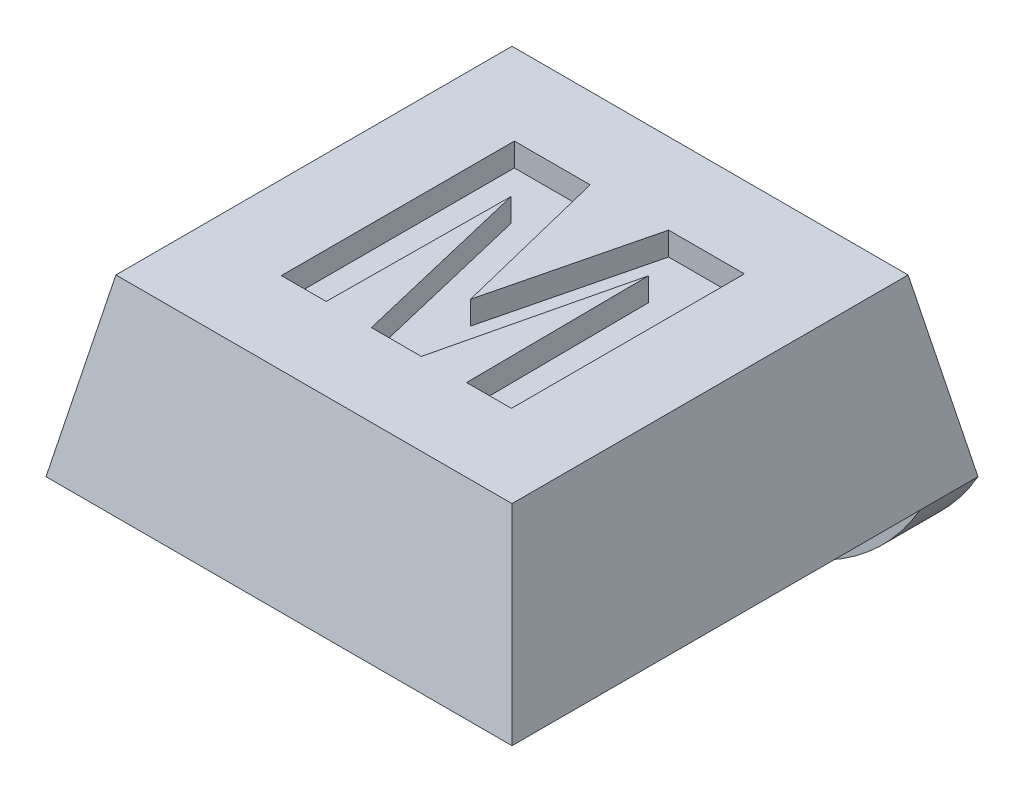
ISO-10303-21;
HEADER;
FILE_DESCRIPTION(('STEP AP214'),'2;1');
FILE_NAME('part.step','',(''),(''),'','','');
FILE_SCHEMA(('AUTOMOTIVE_DESIGN { 1 0 10303 214 1 1 1 1 }'));
ENDSEC;
DATA;
#1=APPLICATION_CONTEXT('core data for automotive mechanical design processes');
#2=APPLICATION_PROTOCOL_DEFINITION('international standard','automotive_design',2000,#1);
#3=PRODUCT_CONTEXT('',#1,'mechanical');
#4=PRODUCT('Part','Part','',(#3));
#5=PRODUCT_RELATED_PRODUCT_CATEGORY('part','',(#4));
#6=PRODUCT_DEFINITION_FORMATION('','',#4);
#7=PRODUCT_DEFINITION_CONTEXT('part definition',#1,'design');
#8=PRODUCT_DEFINITION('design','',#6,#7);
#9=PRODUCT_DEFINITION_SHAPE('','',#8);
#10=(LENGTH_UNIT() NAMED_UNIT(*) SI_UNIT(.MILLI.,.METRE.));
#11=(NAMED_UNIT(*) PLANE_ANGLE_UNIT() SI_UNIT($,.RADIAN.));
#12=(NAMED_UNIT(*) SI_UNIT($,.STERADIAN.) SOLID_ANGLE_UNIT());
#13=UNCERTAINTY_MEASURE_WITH_UNIT(LENGTH_MEASURE(1.E-05),#10,'distance_accuracy_value','');
#14=(GEOMETRIC_REPRESENTATION_CONTEXT(3) GLOBAL_UNCERTAINTY_ASSIGNED_CONTEXT((#13)) GLOBAL_UNIT_ASSIGNED_CONTEXT((#10,
#11,#12)) REPRESENTATION_CONTEXT('',''));
#15=CARTESIAN_POINT('',(0.,0.,0.));
#16=DIRECTION('',(0.,0.,1.));
#17=DIRECTION('',(1.,0.,0.));
#18=AXIS2_PLACEMENT_3D('',#15,#16,#17);
#19=CARTESIAN_POINT('',(0.,3.,0.));
#20=DIRECTION('',(0.,-1.,0.));
#21=DIRECTION('',(0.,0.,-1.));
#22=AXIS2_PLACEMENT_3D('',#19,#20,#21);
#23=PLANE('',#22);
#24=DIRECTION('',(-1.,0.,0.));
#25=VECTOR('',#24,1.);
#26=CARTESIAN_POINT('',(11.,3.,-0.6));
#27=LINE('',#26,#25);
#28=CARTESIAN_POINT('',(7.4,3.,-0.6));
#29=VERTEX_POINT('',#28);
#30=CARTESIAN_POINT('',(0.6,3.,-0.6));
#31=VERTEX_POINT('',#30);
#32=EDGE_CURVE('E236',#29,#31,#27,.T.);
#33=ORIENTED_EDGE('',*,*,#32,.F.);
#34=DIRECTION('',(0.,0.,1.));
#35=VECTOR('',#34,1.);
#36=CARTESIAN_POINT('',(7.4,3.,-8.));
#37=LINE('',#36,#35);
#38=CARTESIAN_POINT('',(7.4,3.,-7.4));
#39=VERTEX_POINT('',#38);
#40=EDGE_CURVE('E249',#39,#29,#37,.T.);
#41=ORIENTED_EDGE('',*,*,#40,.F.);
#42=DIRECTION('',(-1.,0.,0.));
#43=VECTOR('',#42,1.);
#44=CARTESIAN_POINT('',(11.,3.,-7.4));
#45=LINE('',#44,#43);
#46=CARTESIAN_POINT('',(0.599999999999999,3.,-7.4));
#47=VERTEX_POINT('',#46);
#48=EDGE_CURVE('E232',#39,#47,#45,.T.);
#49=ORIENTED_EDGE('',*,*,#48,.T.);
#50=DIRECTION('',(0.,0.,1.));
#51=VECTOR('',#50,1.);
#52=CARTESIAN_POINT('',(0.6,3.,-8.));
#53=LINE('',#52,#51);
#54=EDGE_CURVE('E252',#47,#31,#53,.T.);
#55=ORIENTED_EDGE('',*,*,#54,.T.);
#56=EDGE_LOOP('',(#33,#41,#49,#55));
#57=FACE_BOUND('',#56,.T.);
#58=DIRECTION('',(-1.,0.,0.));
#59=VECTOR('',#58,1.);
#60=CARTESIAN_POINT('',(2.79952143387891,3.,-2.0105672247147));
#61=LINE('',#60,#59);
#62=CARTESIAN_POINT('',(2.79952143387891,3.,-2.0105672247147));
#63=VERTEX_POINT('',#62);
#64=CARTESIAN_POINT('',(2.03029066464814,3.,-2.0105672247147));
#65=VERTEX_POINT('',#64);
#66=EDGE_CURVE('E59',#63,#65,#61,.T.);
#67=ORIENTED_EDGE('',*,*,#66,.T.);
#68=DIRECTION('',(0.,0.,-1.));
#69=VECTOR('',#68,1.);
#70=CARTESIAN_POINT('',(2.03029066464814,3.,-2.0105672247147));
#71=LINE('',#70,#69);
#72=CARTESIAN_POINT('',(2.03029066464814,3.,-6.0105672247147));
#73=VERTEX_POINT('',#72);
#74=EDGE_CURVE('E204',#65,#73,#71,.T.);
#75=ORIENTED_EDGE('',*,*,#74,.T.);
#76=DIRECTION('',(1.,0.,0.));
#77=VECTOR('',#76,1.);
#78=CARTESIAN_POINT('',(2.03029066464814,3.,-6.0105672247147));
#79=LINE('',#78,#77);
#80=CARTESIAN_POINT('',(3.33157271593019,3.,-6.0105672247147));
#81=VERTEX_POINT('',#80);
#82=EDGE_CURVE('E688',#73,#81,#79,.T.);
#83=ORIENTED_EDGE('',*,*,#82,.T.);
#84=DIRECTION('',(0.239515349551575,0.,0.970892577646563));
#85=VECTOR('',#84,1.);
#86=CARTESIAN_POINT('',(3.33157271593019,3.,-6.0105672247147));
#87=LINE('',#86,#85);
#88=CARTESIAN_POINT('',(4.00464963900711,3.,-3.28220184009932));
#89=VERTEX_POINT('',#88);
#90=EDGE_CURVE('E690',#81,#89,#87,.T.);
#91=ORIENTED_EDGE('',*,*,#90,.T.);
#92=DIRECTION('',(0.239515349551575,0.,-0.970892577646563));
#93=VECTOR('',#92,1.);
#94=CARTESIAN_POINT('',(4.00464963900711,3.,-3.28220184009932));
#95=LINE('',#94,#93);
#96=CARTESIAN_POINT('',(4.67772656208403,3.,-6.0105672247147));
#97=VERTEX_POINT('',#96);
#98=EDGE_CURVE('E695',#89,#97,#95,.T.);
#99=ORIENTED_EDGE('',*,*,#98,.T.);
#100=DIRECTION('',(1.,0.,0.));
#101=VECTOR('',#100,1.);
#102=CARTESIAN_POINT('',(4.67772656208403,3.,-6.0105672247147));
#103=LINE('',#102,#101);
#104=CARTESIAN_POINT('',(5.97900861336609,3.,-6.0105672247147));
#105=VERTEX_POINT('',#104);
#106=EDGE_CURVE('E705',#97,#105,#103,.T.);
#107=ORIENTED_EDGE('',*,*,#106,.T.);
#108=DIRECTION('',(0.,0.,1.));
#109=VECTOR('',#108,1.);
#110=CARTESIAN_POINT('',(5.97900861336609,3.,-6.0105672247147));
#111=LINE('',#110,#109);
#112=CARTESIAN_POINT('',(5.97900861336609,3.,-2.0105672247147));
#113=VERTEX_POINT('',#112);
#114=EDGE_CURVE('E709',#105,#113,#111,.T.);
#115=ORIENTED_EDGE('',*,*,#114,.T.);
#116=DIRECTION('',(-1.,0.,0.));
#117=VECTOR('',#116,1.);
#118=CARTESIAN_POINT('',(5.97900861336609,3.,-2.0105672247147));
#119=LINE('',#118,#117);
#120=CARTESIAN_POINT('',(5.20977784413532,3.,-2.0105672247147));
#121=VERTEX_POINT('',#120);
#122=EDGE_CURVE('E713',#113,#121,#119,.T.);
#123=ORIENTED_EDGE('',*,*,#122,.T.);
#124=DIRECTION('',(-0.00814222372760895,0.,-0.999966851546975));
#125=VECTOR('',#124,1.);
#126=CARTESIAN_POINT('',(5.20977784413532,3.,-2.0105672247147));
#127=LINE('',#126,#125);
#128=CARTESIAN_POINT('',(5.18413681849429,3.,-5.15960568625316));
#129=VERTEX_POINT('',#128);
#130=EDGE_CURVE('E717',#121,#129,#127,.T.);
#131=ORIENTED_EDGE('',*,*,#130,.T.);
#132=DIRECTION('',(-0.231921677320602,0.,0.972734463041584));
#133=VECTOR('',#132,1.);
#134=CARTESIAN_POINT('',(5.18413681849429,3.,-5.15960568625316));
#135=LINE('',#134,#133);
#136=CARTESIAN_POINT('',(4.43333553644301,3.,-2.0105672247147));
#137=VERTEX_POINT('',#136);
#138=EDGE_CURVE('E651',#129,#137,#135,.T.);
#139=ORIENTED_EDGE('',*,*,#138,.T.);
#140=DIRECTION('',(-1.,0.,0.));
#141=VECTOR('',#140,1.);
#142=CARTESIAN_POINT('',(4.43333553644301,3.,-2.0105672247147));
#143=LINE('',#142,#141);
#144=CARTESIAN_POINT('',(3.57596374157121,3.,-2.0105672247147));
#145=VERTEX_POINT('',#144);
#146=EDGE_CURVE('E646',#137,#145,#143,.T.);
#147=ORIENTED_EDGE('',*,*,#146,.T.);
#148=DIRECTION('',(-0.231921677320602,0.,-0.972734463041584));
#149=VECTOR('',#148,1.);
#150=CARTESIAN_POINT('',(3.57596374157121,3.,-2.0105672247147));
#151=LINE('',#150,#149);
#152=CARTESIAN_POINT('',(2.82516245951993,3.,-5.15960568625316));
#153=VERTEX_POINT('',#152);
#154=EDGE_CURVE('E640',#145,#153,#151,.T.);
#155=ORIENTED_EDGE('',*,*,#154,.T.);
#156=DIRECTION('',(-0.00814222372760895,0.,0.999966851546975));
#157=VECTOR('',#156,1.);
#158=CARTESIAN_POINT('',(2.82516245951993,3.,-5.15960568625316));
#159=LINE('',#158,#157);
#160=EDGE_CURVE('E200',#153,#63,#159,.T.);
#161=ORIENTED_EDGE('',*,*,#160,.T.);
#162=EDGE_LOOP('',(#67,#75,#83,#91,#99,#107,#115,#123,#131,#139,#147,#155,#161));
#163=FACE_BOUND('',#162,.T.);
#164=ADVANCED_FACE('F43',(#57,#163),#23,.F.);
#165=CARTESIAN_POINT('',(8.,0.,-8.));
#166=DIRECTION('',(-0.98058067569092,-0.196116135138184,0.));
#167=DIRECTION('',(0.196116135138184,-0.98058067569092,0.));
#168=AXIS2_PLACEMENT_3D('',#165,#166,#167);
#169=PLANE('',#168);
#170=DIRECTION('',(-0.192450089729875,0.962250448649376,-0.192450089729875));
#171=VECTOR('',#170,1.);
#172=CARTESIAN_POINT('',(7.7037037037037,1.48148148148148,-0.296296296296296));
#173=LINE('',#172,#171);
#174=CARTESIAN_POINT('',(8.,0.,0.));
#175=VERTEX_POINT('',#174);
#176=EDGE_CURVE('E246',#175,#29,#173,.T.);
#177=ORIENTED_EDGE('',*,*,#176,.F.);
#178=DIRECTION('',(0.,0.,-1.));
#179=VECTOR('',#178,1.);
#180=CARTESIAN_POINT('',(8.,0.,0.));
#181=LINE('',#180,#179);
#182=CARTESIAN_POINT('',(8.,0.,-7.));
#183=VERTEX_POINT('',#182);
#184=EDGE_CURVE('E265',#175,#183,#181,.T.);
#185=ORIENTED_EDGE('',*,*,#184,.T.);
#186=DIRECTION('',(0.,0.,1.));
#187=VECTOR('',#186,1.);
#188=CARTESIAN_POINT('',(8.,0.,-8.));
#189=LINE('',#188,#187);
#190=CARTESIAN_POINT('',(8.,0.,-8.));
#191=VERTEX_POINT('',#190);
#192=EDGE_CURVE('E206',#191,#183,#189,.T.);
#193=ORIENTED_EDGE('',*,*,#192,.F.);
#194=DIRECTION('',(0.192450089729875,-0.962250448649376,-0.192450089729875));
#195=VECTOR('',#194,1.);
#196=CARTESIAN_POINT('',(8.,0.,-8.));
#197=LINE('',#196,#195);
#198=EDGE_CURVE('E239',#39,#191,#197,.T.);
#199=ORIENTED_EDGE('',*,*,#198,.F.);
#200=ORIENTED_EDGE('',*,*,#40,.T.);
#201=EDGE_LOOP('',(#177,#185,#193,#199,#200));
#202=FACE_BOUND('',#201,.T.);
#203=ADVANCED_FACE('F333',(#202),#169,.F.);
#204=CARTESIAN_POINT('',(0.,0.,-8.));
#205=DIRECTION('',(0.98058067569092,-0.196116135138184,0.));
#206=DIRECTION('',(0.196116135138184,0.98058067569092,0.));
#207=AXIS2_PLACEMENT_3D('',#204,#205,#206);
#208=PLANE('',#207);
#209=DIRECTION('',(-0.192450089729875,-0.962250448649376,0.192450089729875));
#210=VECTOR('',#209,1.);
#211=CARTESIAN_POINT('',(0.296296296296296,1.48148148148148,-0.296296296296296));
#212=LINE('',#211,#210);
#213=CARTESIAN_POINT('',(0.,0.,0.));
#214=VERTEX_POINT('',#213);
#215=EDGE_CURVE('E293',#31,#214,#212,.T.);
#216=ORIENTED_EDGE('',*,*,#215,.F.);
#217=ORIENTED_EDGE('',*,*,#54,.F.);
#218=DIRECTION('',(0.192450089729875,0.962250448649376,0.192450089729875));
#219=VECTOR('',#218,1.);
#220=CARTESIAN_POINT('',(0.,0.,-8.));
#221=LINE('',#220,#219);
#222=CARTESIAN_POINT('',(0.,0.,-8.));
#223=VERTEX_POINT('',#222);
#224=EDGE_CURVE('E264',#223,#47,#221,.T.);
#225=ORIENTED_EDGE('',*,*,#224,.F.);
#226=DIRECTION('',(0.,0.,1.));
#227=VECTOR('',#226,1.);
#228=CARTESIAN_POINT('',(0.,0.,0.));
#229=LINE('',#228,#227);
#230=CARTESIAN_POINT('',(0.,0.,-7.));
#231=VERTEX_POINT('',#230);
#232=EDGE_CURVE('E269',#223,#231,#229,.T.);
#233=ORIENTED_EDGE('',*,*,#232,.T.);
#234=EDGE_CURVE('E256',#231,#214,#229,.T.);
#235=ORIENTED_EDGE('',*,*,#234,.T.);
#236=EDGE_LOOP('',(#216,#217,#225,#233,#235));
#237=FACE_BOUND('',#236,.T.);
#238=ADVANCED_FACE('F317',(#237),#208,.F.);
#239=CARTESIAN_POINT('',(0.,0.,0.));
#240=DIRECTION('',(0.,-1.,0.));
#241=DIRECTION('',(0.,0.,-1.));
#242=AXIS2_PLACEMENT_3D('',#239,#240,#241);
#243=PLANE('',#242);
#244=DIRECTION('',(-1.,0.,0.));
#245=VECTOR('',#244,1.);
#246=CARTESIAN_POINT('',(0.,0.,-7.));
#247=LINE('',#246,#245);
#248=EDGE_CURVE('E212',#183,#231,#247,.T.);
#249=ORIENTED_EDGE('',*,*,#248,.F.);
#250=ORIENTED_EDGE('',*,*,#184,.F.);
#251=DIRECTION('',(1.,0.,0.));
#252=VECTOR('',#251,1.);
#253=CARTESIAN_POINT('',(0.,0.,0.));
#254=LINE('',#253,#252);
#255=EDGE_CURVE('E266',#214,#175,#254,.T.);
#256=ORIENTED_EDGE('',*,*,#255,.F.);
#257=ORIENTED_EDGE('',*,*,#234,.F.);
#258=EDGE_LOOP('',(#249,#250,#256,#257));
#259=FACE_BOUND('',#258,.T.);
#260=CARTESIAN_POINT('',(4.,0.,-3.75));
#261=DIRECTION('',(0.,-1.,0.));
#262=DIRECTION('',(0.,0.,-1.));
#263=AXIS2_PLACEMENT_3D('',#260,#261,#262);
#264=CIRCLE('',#263,1.75);
#265=CARTESIAN_POINT('',(4.,0.,-5.5));
#266=VERTEX_POINT('',#265);
#267=EDGE_CURVE('E224',#266,#266,#264,.T.);
#268=ORIENTED_EDGE('',*,*,#267,.F.);
#269=EDGE_LOOP('',(#268));
#270=FACE_BOUND('',#269,.T.);
#271=ADVANCED_FACE('F328',(#259,#270),#243,.T.);
#272=CARTESIAN_POINT('',(11.,3.,-7.4));
#273=DIRECTION('',(0.,0.196116135138184,-0.98058067569092));
#274=DIRECTION('',(0.,0.98058067569092,0.196116135138184));
#275=AXIS2_PLACEMENT_3D('',#272,#273,#274);
#276=PLANE('',#275);
#277=ORIENTED_EDGE('',*,*,#198,.T.);
#278=DIRECTION('',(-1.,0.,0.));
#279=VECTOR('',#278,1.);
#280=CARTESIAN_POINT('',(0.,0.,-8.));
#281=LINE('',#280,#279);
#282=EDGE_CURVE('E260',#191,#223,#281,.T.);
#283=ORIENTED_EDGE('',*,*,#282,.T.);
#284=ORIENTED_EDGE('',*,*,#224,.T.);
#285=ORIENTED_EDGE('',*,*,#48,.F.);
#286=EDGE_LOOP('',(#277,#283,#284,#285));
#287=FACE_BOUND('',#286,.T.);
#288=ADVANCED_FACE('F312',(#287),#276,.T.);
#289=CARTESIAN_POINT('',(11.,0.,0.));
#290=DIRECTION('',(0.,0.196116135138184,0.98058067569092));
#291=DIRECTION('',(0.,-0.98058067569092,0.196116135138184));
#292=AXIS2_PLACEMENT_3D('',#289,#290,#291);
#293=PLANE('',#292);
#294=ORIENTED_EDGE('',*,*,#176,.T.);
#295=ORIENTED_EDGE('',*,*,#32,.T.);
#296=ORIENTED_EDGE('',*,*,#215,.T.);
#297=ORIENTED_EDGE('',*,*,#255,.T.);
#298=EDGE_LOOP('',(#294,#295,#296,#297));
#299=FACE_BOUND('',#298,.T.);
#300=ADVANCED_FACE('F357',(#299),#293,.T.);
#301=CARTESIAN_POINT('',(4.,0.4,-3.75));
#302=DIRECTION('',(0.,-1.,0.));
#303=DIRECTION('',(0.,0.,-1.));
#304=AXIS2_PLACEMENT_3D('',#301,#302,#303);
#305=CYLINDRICAL_SURFACE('',#304,1.75);
#306=CARTESIAN_POINT('',(4.,0.4,-3.75));
#307=DIRECTION('',(0.,-1.,0.));
#308=DIRECTION('',(0.,0.,-1.));
#309=AXIS2_PLACEMENT_3D('',#306,#307,#308);
#310=CIRCLE('',#309,1.75);
#311=CARTESIAN_POINT('',(4.,0.4,-5.5));
#312=VERTEX_POINT('',#311);
#313=EDGE_CURVE('E228',#312,#312,#310,.T.);
#314=ORIENTED_EDGE('',*,*,#313,.F.);
#315=EDGE_LOOP('',(#314));
#316=FACE_BOUND('',#315,.T.);
#317=ORIENTED_EDGE('',*,*,#267,.T.);
#318=EDGE_LOOP('',(#317));
#319=FACE_BOUND('',#318,.T.);
#320=ADVANCED_FACE('F364',(#316,#319),#305,.F.);
#321=CARTESIAN_POINT('',(4.,0.4,-3.75));
#322=DIRECTION('',(0.,-1.,0.));
#323=DIRECTION('',(0.,0.,-1.));
#324=AXIS2_PLACEMENT_3D('',#321,#322,#323);
#325=PLANE('',#324);
#326=ORIENTED_EDGE('',*,*,#313,.T.);
#327=EDGE_LOOP('',(#326));
#328=FACE_BOUND('',#327,.T.);
#329=ADVANCED_FACE('F368',(#328),#325,.T.);
#330=CARTESIAN_POINT('',(0.,-2.,-8.));
#331=DIRECTION('',(0.,0.,1.));
#332=DIRECTION('',(1.,0.,0.));
#333=AXIS2_PLACEMENT_3D('',#330,#331,#332);
#334=PLANE('',#333);
#335=ORIENTED_EDGE('',*,*,#282,.F.);
#336=CARTESIAN_POINT('',(4.53589838486225,2.,-8.));
#337=DIRECTION('',(0.,0.,1.));
#338=DIRECTION('',(1.,0.,0.));
#339=AXIS2_PLACEMENT_3D('',#336,#337,#338);
#340=CIRCLE('',#339,4.);
#341=CARTESIAN_POINT('',(4.53589838486225,-2.,-8.));
#342=VERTEX_POINT('',#341);
#343=EDGE_CURVE('E11',#191,#342,#340,.F.);
#344=ORIENTED_EDGE('',*,*,#343,.T.);
#345=DIRECTION('',(1.,0.,0.));
#346=VECTOR('',#345,1.);
#347=CARTESIAN_POINT('',(0.,-2.,-8.));
#348=LINE('',#347,#346);
#349=CARTESIAN_POINT('',(3.46410161513775,-2.,-8.));
#350=VERTEX_POINT('',#349);
#351=EDGE_CURVE('E218',#350,#342,#348,.T.);
#352=ORIENTED_EDGE('',*,*,#351,.F.);
#353=CARTESIAN_POINT('',(3.46410161513775,2.,-8.));
#354=DIRECTION('',(0.,0.,1.));
#355=DIRECTION('',(1.,0.,0.));
#356=AXIS2_PLACEMENT_3D('',#353,#354,#355);
#357=CIRCLE('',#356,4.);
#358=EDGE_CURVE('E52',#350,#223,#357,.F.);
#359=ORIENTED_EDGE('',*,*,#358,.T.);
#360=EDGE_LOOP('',(#335,#344,#352,#359));
#361=FACE_BOUND('',#360,.T.);
#362=ADVANCED_FACE('F305',(#361),#334,.F.);
#363=CARTESIAN_POINT('',(0.,-2.,-7.));
#364=DIRECTION('',(0.,0.,-1.));
#365=DIRECTION('',(-1.,0.,0.));
#366=AXIS2_PLACEMENT_3D('',#363,#364,#365);
#367=PLANE('',#366);
#368=DIRECTION('',(-1.,0.,0.));
#369=VECTOR('',#368,1.);
#370=CARTESIAN_POINT('',(0.,-2.,-7.));
#371=LINE('',#370,#369);
#372=CARTESIAN_POINT('',(4.53589838486225,-2.,-7.));
#373=VERTEX_POINT('',#372);
#374=CARTESIAN_POINT('',(3.46410161513775,-2.,-7.));
#375=VERTEX_POINT('',#374);
#376=EDGE_CURVE('E222',#373,#375,#371,.T.);
#377=ORIENTED_EDGE('',*,*,#376,.F.);
#378=CARTESIAN_POINT('',(4.53589838486225,2.,-7.));
#379=DIRECTION('',(0.,0.,-1.));
#380=DIRECTION('',(-1.,0.,0.));
#381=AXIS2_PLACEMENT_3D('',#378,#379,#380);
#382=CIRCLE('',#381,4.);
#383=EDGE_CURVE('E299',#373,#183,#382,.F.);
#384=ORIENTED_EDGE('',*,*,#383,.T.);
#385=ORIENTED_EDGE('',*,*,#248,.T.);
#386=CARTESIAN_POINT('',(3.46410161513775,2.,-7.));
#387=DIRECTION('',(0.,0.,-1.));
#388=DIRECTION('',(-1.,0.,0.));
#389=AXIS2_PLACEMENT_3D('',#386,#387,#388);
#390=CIRCLE('',#389,4.);
#391=EDGE_CURVE('E67',#231,#375,#390,.F.);
#392=ORIENTED_EDGE('',*,*,#391,.T.);
#393=EDGE_LOOP('',(#377,#384,#385,#392));
#394=FACE_BOUND('',#393,.T.);
#395=ADVANCED_FACE('F323',(#394),#367,.F.);
#396=CARTESIAN_POINT('',(0.,-2.,0.));
#397=DIRECTION('',(0.,1.,0.));
#398=DIRECTION('',(0.,0.,1.));
#399=AXIS2_PLACEMENT_3D('',#396,#397,#398);
#400=PLANE('',#399);
#401=ORIENTED_EDGE('',*,*,#351,.T.);
#402=DIRECTION('',(0.,0.,1.));
#403=VECTOR('',#402,1.);
#404=CARTESIAN_POINT('',(4.53589838486225,-2.,0.));
#405=LINE('',#404,#403);
#406=EDGE_CURVE('E292',#342,#373,#405,.T.);
#407=ORIENTED_EDGE('',*,*,#406,.T.);
#408=ORIENTED_EDGE('',*,*,#376,.T.);
#409=DIRECTION('',(0.,0.,-1.));
#410=VECTOR('',#409,1.);
#411=CARTESIAN_POINT('',(3.46410161513775,-2.,0.));
#412=LINE('',#411,#410);
#413=EDGE_CURVE('E288',#375,#350,#412,.T.);
#414=ORIENTED_EDGE('',*,*,#413,.T.);
#415=EDGE_LOOP('',(#401,#407,#408,#414));
#416=FACE_BOUND('',#415,.T.);
#417=ADVANCED_FACE('F321',(#416),#400,.F.);
#418=CARTESIAN_POINT('',(4.53589838486225,2.,-8.));
#419=DIRECTION('',(0.,0.,1.));
#420=DIRECTION('',(1.,0.,0.));
#421=AXIS2_PLACEMENT_3D('',#418,#419,#420);
#422=CYLINDRICAL_SURFACE('',#421,4.);
#423=ORIENTED_EDGE('',*,*,#343,.F.);
#424=ORIENTED_EDGE('',*,*,#192,.T.);
#425=ORIENTED_EDGE('',*,*,#383,.F.);
#426=ORIENTED_EDGE('',*,*,#406,.F.);
#427=EDGE_LOOP('',(#423,#424,#425,#426));
#428=FACE_BOUND('',#427,.T.);
#429=ADVANCED_FACE('F334',(#428),#422,.T.);
#430=CARTESIAN_POINT('',(3.46410161513775,2.,-8.));
#431=DIRECTION('',(0.,0.,-1.));
#432=DIRECTION('',(-1.,0.,0.));
#433=AXIS2_PLACEMENT_3D('',#430,#431,#432);
#434=CYLINDRICAL_SURFACE('',#433,4.);
#435=ORIENTED_EDGE('',*,*,#391,.F.);
#436=ORIENTED_EDGE('',*,*,#232,.F.);
#437=ORIENTED_EDGE('',*,*,#358,.F.);
#438=ORIENTED_EDGE('',*,*,#413,.F.);
#439=EDGE_LOOP('',(#435,#436,#437,#438));
#440=FACE_BOUND('',#439,.T.);
#441=ADVANCED_FACE('F45',(#440),#434,.T.);
#442=CARTESIAN_POINT('',(2.79952143387891,2.6,-2.0105672247147));
#443=DIRECTION('',(0.,0.,-1.));
#444=DIRECTION('',(-1.,0.,0.));
#445=AXIS2_PLACEMENT_3D('',#442,#443,#444);
#446=PLANE('',#445);
#447=ORIENTED_EDGE('',*,*,#66,.F.);
#448=DIRECTION('',(0.,1.,0.));
#449=VECTOR('',#448,1.);
#450=CARTESIAN_POINT('',(2.79952143387891,2.6,-2.0105672247147));
#451=LINE('',#450,#449);
#452=CARTESIAN_POINT('',(2.79952143387891,2.6,-2.0105672247147));
#453=VERTEX_POINT('',#452);
#454=EDGE_CURVE('E198',#453,#63,#451,.T.);
#455=ORIENTED_EDGE('',*,*,#454,.F.);
#456=DIRECTION('',(-1.,0.,0.));
#457=VECTOR('',#456,1.);
#458=CARTESIAN_POINT('',(2.79952143387891,2.6,-2.0105672247147));
#459=LINE('',#458,#457);
#460=CARTESIAN_POINT('',(2.03029066464814,2.6,-2.0105672247147));
#461=VERTEX_POINT('',#460);
#462=EDGE_CURVE('E188',#453,#461,#459,.T.);
#463=ORIENTED_EDGE('',*,*,#462,.T.);
#464=DIRECTION('',(0.,1.,0.));
#465=VECTOR('',#464,1.);
#466=CARTESIAN_POINT('',(2.03029066464814,2.6,-2.0105672247147));
#467=LINE('',#466,#465);
#468=EDGE_CURVE('E197',#461,#65,#467,.T.);
#469=ORIENTED_EDGE('',*,*,#468,.T.);
#470=EDGE_LOOP('',(#447,#455,#463,#469));
#471=FACE_BOUND('',#470,.T.);
#472=ADVANCED_FACE('F196',(#471),#446,.T.);
#473=CARTESIAN_POINT('',(2.03029066464814,2.6,-2.0105672247147));
#474=DIRECTION('',(1.,0.,0.));
#475=DIRECTION('',(0.,0.,-1.));
#476=AXIS2_PLACEMENT_3D('',#473,#474,#475);
#477=PLANE('',#476);
#478=ORIENTED_EDGE('',*,*,#74,.F.);
#479=ORIENTED_EDGE('',*,*,#468,.F.);
#480=DIRECTION('',(0.,0.,-1.));
#481=VECTOR('',#480,1.);
#482=CARTESIAN_POINT('',(2.03029066464814,2.6,-2.0105672247147));
#483=LINE('',#482,#481);
#484=CARTESIAN_POINT('',(2.03029066464814,2.6,-6.0105672247147));
#485=VERTEX_POINT('',#484);
#486=EDGE_CURVE('E184',#461,#485,#483,.T.);
#487=ORIENTED_EDGE('',*,*,#486,.T.);
#488=DIRECTION('',(0.,1.,0.));
#489=VECTOR('',#488,1.);
#490=CARTESIAN_POINT('',(2.03029066464814,2.6,-6.0105672247147));
#491=LINE('',#490,#489);
#492=EDGE_CURVE('E207',#485,#73,#491,.T.);
#493=ORIENTED_EDGE('',*,*,#492,.T.);
#494=EDGE_LOOP('',(#478,#479,#487,#493));
#495=FACE_BOUND('',#494,.T.);
#496=ADVANCED_FACE('F202',(#495),#477,.T.);
#497=CARTESIAN_POINT('',(2.03029066464814,2.6,-6.0105672247147));
#498=DIRECTION('',(0.,0.,1.));
#499=DIRECTION('',(1.,0.,0.));
#500=AXIS2_PLACEMENT_3D('',#497,#498,#499);
#501=PLANE('',#500);
#502=ORIENTED_EDGE('',*,*,#82,.F.);
#503=ORIENTED_EDGE('',*,*,#492,.F.);
#504=DIRECTION('',(1.,0.,0.));
#505=VECTOR('',#504,1.);
#506=CARTESIAN_POINT('',(2.03029066464814,2.6,-6.0105672247147));
#507=LINE('',#506,#505);
#508=CARTESIAN_POINT('',(3.33157271593019,2.6,-6.0105672247147));
#509=VERTEX_POINT('',#508);
#510=EDGE_CURVE('E190',#485,#509,#507,.T.);
#511=ORIENTED_EDGE('',*,*,#510,.T.);
#512=DIRECTION('',(0.,1.,0.));
#513=VECTOR('',#512,1.);
#514=CARTESIAN_POINT('',(3.33157271593019,2.6,-6.0105672247147));
#515=LINE('',#514,#513);
#516=EDGE_CURVE('E214',#509,#81,#515,.T.);
#517=ORIENTED_EDGE('',*,*,#516,.T.);
#518=EDGE_LOOP('',(#502,#503,#511,#517));
#519=FACE_BOUND('',#518,.T.);
#520=ADVANCED_FACE('F381',(#519),#501,.T.);
#521=CARTESIAN_POINT('',(3.33157271593019,2.6,-6.0105672247147));
#522=DIRECTION('',(-0.970892577646563,0.,0.239515349551575));
#523=DIRECTION('',(0.239515349551575,0.,0.970892577646563));
#524=AXIS2_PLACEMENT_3D('',#521,#522,#523);
#525=PLANE('',#524);
#526=ORIENTED_EDGE('',*,*,#90,.F.);
#527=ORIENTED_EDGE('',*,*,#516,.F.);
#528=DIRECTION('',(0.239515349551575,0.,0.970892577646563));
#529=VECTOR('',#528,1.);
#530=CARTESIAN_POINT('',(3.33157271593019,2.6,-6.0105672247147));
#531=LINE('',#530,#529);
#532=CARTESIAN_POINT('',(4.00464963900711,2.6,-3.28220184009932));
#533=VERTEX_POINT('',#532);
#534=EDGE_CURVE('E756',#509,#533,#531,.T.);
#535=ORIENTED_EDGE('',*,*,#534,.T.);
#536=DIRECTION('',(0.,1.,0.));
#537=VECTOR('',#536,1.);
#538=CARTESIAN_POINT('',(4.00464963900711,2.6,-3.28220184009932));
#539=LINE('',#538,#537);
#540=EDGE_CURVE('E681',#533,#89,#539,.T.);
#541=ORIENTED_EDGE('',*,*,#540,.T.);
#542=EDGE_LOOP('',(#526,#527,#535,#541));
#543=FACE_BOUND('',#542,.T.);
#544=ADVANCED_FACE('F384',(#543),#525,.T.);
#545=CARTESIAN_POINT('',(4.00464963900711,2.6,-3.28220184009932));
#546=DIRECTION('',(0.970892577646563,0.,0.239515349551575));
#547=DIRECTION('',(0.239515349551575,0.,-0.970892577646563));
#548=AXIS2_PLACEMENT_3D('',#545,#546,#547);
#549=PLANE('',#548);
#550=ORIENTED_EDGE('',*,*,#98,.F.);
#551=ORIENTED_EDGE('',*,*,#540,.F.);
#552=DIRECTION('',(0.239515349551575,0.,-0.970892577646563));
#553=VECTOR('',#552,1.);
#554=CARTESIAN_POINT('',(4.00464963900711,2.6,-3.28220184009932));
#555=LINE('',#554,#553);
#556=CARTESIAN_POINT('',(4.67772656208403,2.6,-6.0105672247147));
#557=VERTEX_POINT('',#556);
#558=EDGE_CURVE('E753',#533,#557,#555,.T.);
#559=ORIENTED_EDGE('',*,*,#558,.T.);
#560=DIRECTION('',(0.,1.,0.));
#561=VECTOR('',#560,1.);
#562=CARTESIAN_POINT('',(4.67772656208403,2.6,-6.0105672247147));
#563=LINE('',#562,#561);
#564=EDGE_CURVE('E678',#557,#97,#563,.T.);
#565=ORIENTED_EDGE('',*,*,#564,.T.);
#566=EDGE_LOOP('',(#550,#551,#559,#565));
#567=FACE_BOUND('',#566,.T.);
#568=ADVANCED_FACE('F388',(#567),#549,.T.);
#569=CARTESIAN_POINT('',(4.67772656208403,2.6,-6.0105672247147));
#570=DIRECTION('',(0.,0.,1.));
#571=DIRECTION('',(1.,0.,0.));
#572=AXIS2_PLACEMENT_3D('',#569,#570,#571);
#573=PLANE('',#572);
#574=ORIENTED_EDGE('',*,*,#106,.F.);
#575=ORIENTED_EDGE('',*,*,#564,.F.);
#576=DIRECTION('',(1.,0.,0.));
#577=VECTOR('',#576,1.);
#578=CARTESIAN_POINT('',(4.67772656208403,2.6,-6.0105672247147));
#579=LINE('',#578,#577);
#580=CARTESIAN_POINT('',(5.97900861336609,2.6,-6.0105672247147));
#581=VERTEX_POINT('',#580);
#582=EDGE_CURVE('E750',#557,#581,#579,.T.);
#583=ORIENTED_EDGE('',*,*,#582,.T.);
#584=DIRECTION('',(0.,1.,0.));
#585=VECTOR('',#584,1.);
#586=CARTESIAN_POINT('',(5.97900861336609,2.6,-6.0105672247147));
#587=LINE('',#586,#585);
#588=EDGE_CURVE('E675',#581,#105,#587,.T.);
#589=ORIENTED_EDGE('',*,*,#588,.T.);
#590=EDGE_LOOP('',(#574,#575,#583,#589));
#591=FACE_BOUND('',#590,.T.);
#592=ADVANCED_FACE('F392',(#591),#573,.T.);
#593=CARTESIAN_POINT('',(5.97900861336609,2.6,-6.0105672247147));
#594=DIRECTION('',(-1.,0.,0.));
#595=DIRECTION('',(0.,0.,1.));
#596=AXIS2_PLACEMENT_3D('',#593,#594,#595);
#597=PLANE('',#596);
#598=ORIENTED_EDGE('',*,*,#114,.F.);
#599=ORIENTED_EDGE('',*,*,#588,.F.);
#600=DIRECTION('',(0.,0.,1.));
#601=VECTOR('',#600,1.);
#602=CARTESIAN_POINT('',(5.97900861336609,2.6,-6.0105672247147));
#603=LINE('',#602,#601);
#604=CARTESIAN_POINT('',(5.97900861336609,2.6,-2.0105672247147));
#605=VERTEX_POINT('',#604);
#606=EDGE_CURVE('E747',#581,#605,#603,.T.);
#607=ORIENTED_EDGE('',*,*,#606,.T.);
#608=DIRECTION('',(0.,1.,0.));
#609=VECTOR('',#608,1.);
#610=CARTESIAN_POINT('',(5.97900861336609,2.6,-2.0105672247147));
#611=LINE('',#610,#609);
#612=EDGE_CURVE('E672',#605,#113,#611,.T.);
#613=ORIENTED_EDGE('',*,*,#612,.T.);
#614=EDGE_LOOP('',(#598,#599,#607,#613));
#615=FACE_BOUND('',#614,.T.);
#616=ADVANCED_FACE('F396',(#615),#597,.T.);
#617=CARTESIAN_POINT('',(5.97900861336609,2.6,-2.0105672247147));
#618=DIRECTION('',(0.,0.,-1.));
#619=DIRECTION('',(-1.,0.,0.));
#620=AXIS2_PLACEMENT_3D('',#617,#618,#619);
#621=PLANE('',#620);
#622=ORIENTED_EDGE('',*,*,#122,.F.);
#623=ORIENTED_EDGE('',*,*,#612,.F.);
#624=DIRECTION('',(-1.,0.,0.));
#625=VECTOR('',#624,1.);
#626=CARTESIAN_POINT('',(5.97900861336609,2.6,-2.0105672247147));
#627=LINE('',#626,#625);
#628=CARTESIAN_POINT('',(5.20977784413532,2.6,-2.0105672247147));
#629=VERTEX_POINT('',#628);
#630=EDGE_CURVE('E744',#605,#629,#627,.T.);
#631=ORIENTED_EDGE('',*,*,#630,.T.);
#632=DIRECTION('',(0.,1.,0.));
#633=VECTOR('',#632,1.);
#634=CARTESIAN_POINT('',(5.20977784413532,2.6,-2.0105672247147));
#635=LINE('',#634,#633);
#636=EDGE_CURVE('E669',#629,#121,#635,.T.);
#637=ORIENTED_EDGE('',*,*,#636,.T.);
#638=EDGE_LOOP('',(#622,#623,#631,#637));
#639=FACE_BOUND('',#638,.T.);
#640=ADVANCED_FACE('F400',(#639),#621,.T.);
#641=CARTESIAN_POINT('',(5.20977784413532,2.6,-2.0105672247147));
#642=DIRECTION('',(0.999966851546975,0.,-0.00814222372760895));
#643=DIRECTION('',(-0.00814222372760895,0.,-0.999966851546975));
#644=AXIS2_PLACEMENT_3D('',#641,#642,#643);
#645=PLANE('',#644);
#646=ORIENTED_EDGE('',*,*,#130,.F.);
#647=ORIENTED_EDGE('',*,*,#636,.F.);
#648=DIRECTION('',(-0.00814222372760895,0.,-0.999966851546975));
#649=VECTOR('',#648,1.);
#650=CARTESIAN_POINT('',(5.20977784413532,2.6,-2.0105672247147));
#651=LINE('',#650,#649);
#652=CARTESIAN_POINT('',(5.18413681849429,2.6,-5.15960568625316));
#653=VERTEX_POINT('',#652);
#654=EDGE_CURVE('E741',#629,#653,#651,.T.);
#655=ORIENTED_EDGE('',*,*,#654,.T.);
#656=DIRECTION('',(0.,1.,0.));
#657=VECTOR('',#656,1.);
#658=CARTESIAN_POINT('',(5.18413681849429,2.6,-5.15960568625316));
#659=LINE('',#658,#657);
#660=EDGE_CURVE('E666',#653,#129,#659,.T.);
#661=ORIENTED_EDGE('',*,*,#660,.T.);
#662=EDGE_LOOP('',(#646,#647,#655,#661));
#663=FACE_BOUND('',#662,.T.);
#664=ADVANCED_FACE('F404',(#663),#645,.T.);
#665=CARTESIAN_POINT('',(5.18413681849429,2.6,-5.15960568625316));
#666=DIRECTION('',(-0.972734463041584,0.,-0.231921677320602));
#667=DIRECTION('',(-0.231921677320602,0.,0.972734463041584));
#668=AXIS2_PLACEMENT_3D('',#665,#666,#667);
#669=PLANE('',#668);
#670=ORIENTED_EDGE('',*,*,#138,.F.);
#671=ORIENTED_EDGE('',*,*,#660,.F.);
#672=DIRECTION('',(-0.231921677320602,0.,0.972734463041584));
#673=VECTOR('',#672,1.);
#674=CARTESIAN_POINT('',(5.18413681849429,2.6,-5.15960568625316));
#675=LINE('',#674,#673);
#676=CARTESIAN_POINT('',(4.43333553644301,2.6,-2.0105672247147));
#677=VERTEX_POINT('',#676);
#678=EDGE_CURVE('E726',#653,#677,#675,.T.);
#679=ORIENTED_EDGE('',*,*,#678,.T.);
#680=DIRECTION('',(0.,1.,0.));
#681=VECTOR('',#680,1.);
#682=CARTESIAN_POINT('',(4.43333553644301,2.6,-2.0105672247147));
#683=LINE('',#682,#681);
#684=EDGE_CURVE('E663',#677,#137,#683,.T.);
#685=ORIENTED_EDGE('',*,*,#684,.T.);
#686=EDGE_LOOP('',(#670,#671,#679,#685));
#687=FACE_BOUND('',#686,.T.);
#688=ADVANCED_FACE('F408',(#687),#669,.T.);
#689=CARTESIAN_POINT('',(4.43333553644301,2.6,-2.0105672247147));
#690=DIRECTION('',(0.,0.,-1.));
#691=DIRECTION('',(-1.,0.,0.));
#692=AXIS2_PLACEMENT_3D('',#689,#690,#691);
#693=PLANE('',#692);
#694=ORIENTED_EDGE('',*,*,#146,.F.);
#695=ORIENTED_EDGE('',*,*,#684,.F.);
#696=DIRECTION('',(-1.,0.,0.));
#697=VECTOR('',#696,1.);
#698=CARTESIAN_POINT('',(4.43333553644301,2.6,-2.0105672247147));
#699=LINE('',#698,#697);
#700=CARTESIAN_POINT('',(3.57596374157121,2.6,-2.0105672247147));
#701=VERTEX_POINT('',#700);
#702=EDGE_CURVE('E728',#677,#701,#699,.T.);
#703=ORIENTED_EDGE('',*,*,#702,.T.);
#704=DIRECTION('',(0.,1.,0.));
#705=VECTOR('',#704,1.);
#706=CARTESIAN_POINT('',(3.57596374157121,2.6,-2.0105672247147));
#707=LINE('',#706,#705);
#708=EDGE_CURVE('E660',#701,#145,#707,.T.);
#709=ORIENTED_EDGE('',*,*,#708,.T.);
#710=EDGE_LOOP('',(#694,#695,#703,#709));
#711=FACE_BOUND('',#710,.T.);
#712=ADVANCED_FACE('F412',(#711),#693,.T.);
#713=CARTESIAN_POINT('',(3.57596374157121,2.6,-2.0105672247147));
#714=DIRECTION('',(0.972734463041584,0.,-0.231921677320602));
#715=DIRECTION('',(-0.231921677320602,0.,-0.972734463041584));
#716=AXIS2_PLACEMENT_3D('',#713,#714,#715);
#717=PLANE('',#716);
#718=ORIENTED_EDGE('',*,*,#154,.F.);
#719=ORIENTED_EDGE('',*,*,#708,.F.);
#720=DIRECTION('',(-0.231921677320602,0.,-0.972734463041584));
#721=VECTOR('',#720,1.);
#722=CARTESIAN_POINT('',(3.57596374157121,2.6,-2.0105672247147));
#723=LINE('',#722,#721);
#724=CARTESIAN_POINT('',(2.82516245951993,2.6,-5.15960568625316));
#725=VERTEX_POINT('',#724);
#726=EDGE_CURVE('E730',#701,#725,#723,.T.);
#727=ORIENTED_EDGE('',*,*,#726,.T.);
#728=DIRECTION('',(0.,1.,0.));
#729=VECTOR('',#728,1.);
#730=CARTESIAN_POINT('',(2.82516245951993,2.6,-5.15960568625316));
#731=LINE('',#730,#729);
#732=EDGE_CURVE('E638',#725,#153,#731,.T.);
#733=ORIENTED_EDGE('',*,*,#732,.T.);
#734=EDGE_LOOP('',(#718,#719,#727,#733));
#735=FACE_BOUND('',#734,.T.);
#736=ADVANCED_FACE('F416',(#735),#717,.T.);
#737=CARTESIAN_POINT('',(2.82516245951993,2.6,-5.15960568625316));
#738=DIRECTION('',(-0.999966851546975,0.,-0.00814222372760895));
#739=DIRECTION('',(-0.00814222372760895,0.,0.999966851546975));
#740=AXIS2_PLACEMENT_3D('',#737,#738,#739);
#741=PLANE('',#740);
#742=ORIENTED_EDGE('',*,*,#160,.F.);
#743=ORIENTED_EDGE('',*,*,#732,.F.);
#744=DIRECTION('',(-0.00814222372760895,0.,0.999966851546975));
#745=VECTOR('',#744,1.);
#746=CARTESIAN_POINT('',(2.82516245951993,2.6,-5.15960568625316));
#747=LINE('',#746,#745);
#748=EDGE_CURVE('E657',#725,#453,#747,.T.);
#749=ORIENTED_EDGE('',*,*,#748,.T.);
#750=ORIENTED_EDGE('',*,*,#454,.T.);
#751=EDGE_LOOP('',(#742,#743,#749,#750));
#752=FACE_BOUND('',#751,.T.);
#753=ADVANCED_FACE('F420',(#752),#741,.T.);
#754=CARTESIAN_POINT('',(0.,2.6,0.));
#755=DIRECTION('',(0.,-1.,0.));
#756=DIRECTION('',(0.,0.,-1.));
#757=AXIS2_PLACEMENT_3D('',#754,#755,#756);
#758=PLANE('',#757);
#759=ORIENTED_EDGE('',*,*,#462,.F.);
#760=ORIENTED_EDGE('',*,*,#748,.F.);
#761=ORIENTED_EDGE('',*,*,#726,.F.);
#762=ORIENTED_EDGE('',*,*,#702,.F.);
#763=ORIENTED_EDGE('',*,*,#678,.F.);
#764=ORIENTED_EDGE('',*,*,#654,.F.);
#765=ORIENTED_EDGE('',*,*,#630,.F.);
#766=ORIENTED_EDGE('',*,*,#606,.F.);
#767=ORIENTED_EDGE('',*,*,#582,.F.);
#768=ORIENTED_EDGE('',*,*,#558,.F.);
#769=ORIENTED_EDGE('',*,*,#534,.F.);
#770=ORIENTED_EDGE('',*,*,#510,.F.);
#771=ORIENTED_EDGE('',*,*,#486,.F.);
#772=EDGE_LOOP('',(#759,#760,#761,#762,#763,#764,#765,#766,#767,#768,#769,#770,#771));
#773=FACE_BOUND('',#772,.T.);
#774=ADVANCED_FACE('F186',(#773),#758,.F.);
#775=CLOSED_SHELL('',(#164,#203,#238,#271,#288,#300,#320,#329,#362,#395,#417,#429,#441,#472,
#496,#520,#544,#568,#592,#616,#640,#664,#688,#712,#736,#753,#774));
#776=MANIFOLD_SOLID_BREP('B2',#775);
#777=ADVANCED_BREP_SHAPE_REPRESENTATION('',(#18,#776),#14);
#778=SHAPE_DEFINITION_REPRESENTATION(#9,#777);
ENDSEC;
END-ISO-10303-21;
